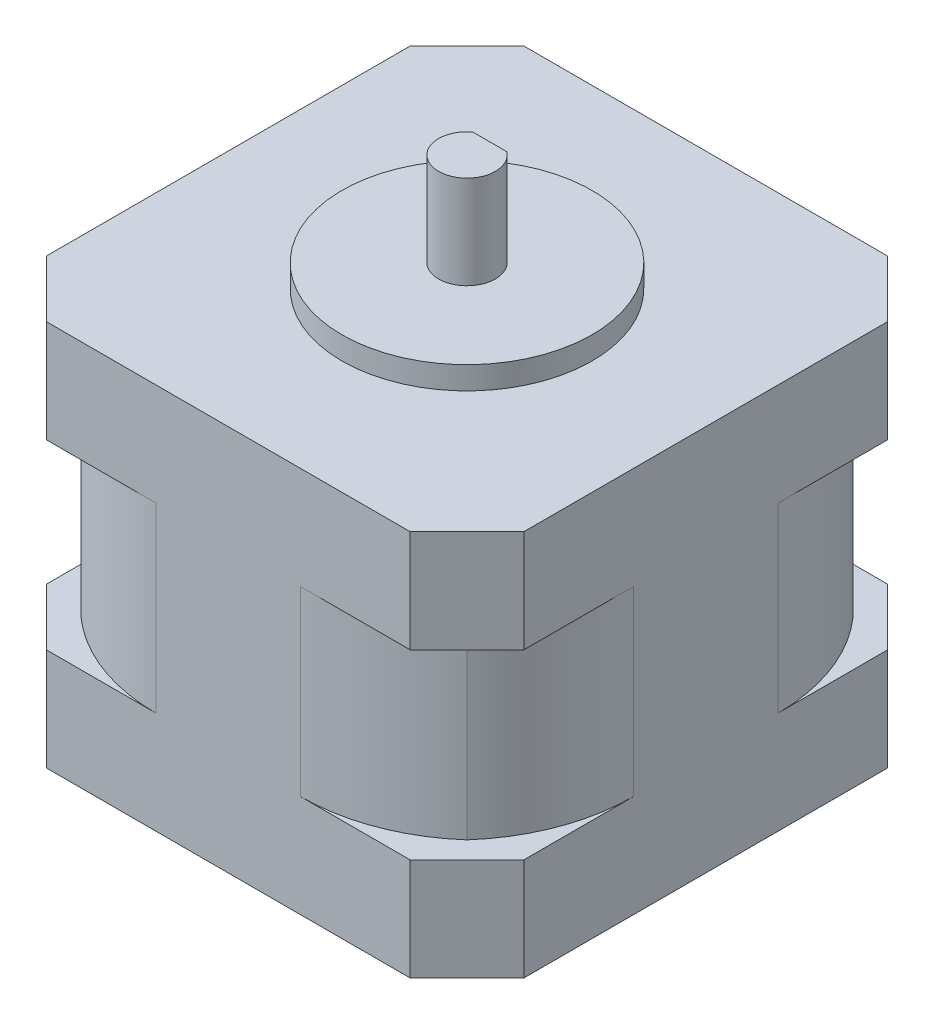
ISO-10303-21;
HEADER;
FILE_DESCRIPTION(('STEP AP214'),'2;1');
FILE_NAME('part.step','',(''),(''),'','','');
FILE_SCHEMA(('AUTOMOTIVE_DESIGN { 1 0 10303 214 1 1 1 1 }'));
ENDSEC;
DATA;
#1=APPLICATION_CONTEXT('core data for automotive mechanical design processes');
#2=APPLICATION_PROTOCOL_DEFINITION('international standard','automotive_design',2000,#1);
#3=PRODUCT_CONTEXT('',#1,'mechanical');
#4=PRODUCT('Part','Part','',(#3));
#5=PRODUCT_RELATED_PRODUCT_CATEGORY('part','',(#4));
#6=PRODUCT_DEFINITION_FORMATION('','',#4);
#7=PRODUCT_DEFINITION_CONTEXT('part definition',#1,'design');
#8=PRODUCT_DEFINITION('design','',#6,#7);
#9=PRODUCT_DEFINITION_SHAPE('','',#8);
#10=(LENGTH_UNIT() NAMED_UNIT(*) SI_UNIT(.MILLI.,.METRE.));
#11=(NAMED_UNIT(*) PLANE_ANGLE_UNIT() SI_UNIT($,.RADIAN.));
#12=(NAMED_UNIT(*) SI_UNIT($,.STERADIAN.) SOLID_ANGLE_UNIT());
#13=UNCERTAINTY_MEASURE_WITH_UNIT(LENGTH_MEASURE(1.E-05),#10,'distance_accuracy_value','');
#14=(GEOMETRIC_REPRESENTATION_CONTEXT(3) GLOBAL_UNCERTAINTY_ASSIGNED_CONTEXT((#13)) GLOBAL_UNIT_ASSIGNED_CONTEXT((#10,
#11,#12)) REPRESENTATION_CONTEXT('',''));
#15=CARTESIAN_POINT('',(0.,0.,0.));
#16=DIRECTION('',(0.,0.,1.));
#17=DIRECTION('',(1.,0.,0.));
#18=AXIS2_PLACEMENT_3D('',#15,#16,#17);
#19=CARTESIAN_POINT('',(21.,17.,21.));
#20=DIRECTION('',(-1.,0.,0.));
#21=DIRECTION('',(0.,0.,1.));
#22=AXIS2_PLACEMENT_3D('',#19,#20,#21);
#23=PLANE('',#22);
#24=DIRECTION('',(0.,0.,-1.));
#25=VECTOR('',#24,1.);
#26=CARTESIAN_POINT('',(21.,-17.,21.));
#27=LINE('',#26,#25);
#28=CARTESIAN_POINT('',(21.,-17.,16.));
#29=VERTEX_POINT('',#28);
#30=CARTESIAN_POINT('',(21.,-17.,-16.));
#31=VERTEX_POINT('',#30);
#32=EDGE_CURVE('E300',#29,#31,#27,.T.);
#33=ORIENTED_EDGE('',*,*,#32,.T.);
#34=DIRECTION('',(0.,1.,0.));
#35=VECTOR('',#34,1.);
#36=CARTESIAN_POINT('',(21.,17.,-16.));
#37=LINE('',#36,#35);
#38=CARTESIAN_POINT('',(20.9999999999998,-8.,-16.));
#39=VERTEX_POINT('',#38);
#40=EDGE_CURVE('E426',#31,#39,#37,.T.);
#41=ORIENTED_EDGE('',*,*,#40,.T.);
#42=DIRECTION('',(0.,0.,-1.));
#43=VECTOR('',#42,1.);
#44=CARTESIAN_POINT('',(20.9999999999999,-8.,-13.0000000000002));
#45=LINE('',#44,#43);
#46=CARTESIAN_POINT('',(20.9999999999999,-8.,-6.37258300203047));
#47=VERTEX_POINT('',#46);
#48=EDGE_CURVE('E281',#47,#39,#45,.T.);
#49=ORIENTED_EDGE('',*,*,#48,.F.);
#50=DIRECTION('',(0.,1.,0.));
#51=VECTOR('',#50,1.);
#52=CARTESIAN_POINT('',(21.,17.,-6.37258300203047));
#53=LINE('',#52,#51);
#54=CARTESIAN_POINT('',(21.,8.,-6.37258300203047));
#55=VERTEX_POINT('',#54);
#56=EDGE_CURVE('E329',#47,#55,#53,.T.);
#57=ORIENTED_EDGE('',*,*,#56,.T.);
#58=DIRECTION('',(0.,0.,-1.));
#59=VECTOR('',#58,1.);
#60=CARTESIAN_POINT('',(20.9999999999999,8.,-13.0000000000002));
#61=LINE('',#60,#59);
#62=CARTESIAN_POINT('',(20.9999999999998,8.,-16.));
#63=VERTEX_POINT('',#62);
#64=EDGE_CURVE('E286',#55,#63,#61,.T.);
#65=ORIENTED_EDGE('',*,*,#64,.T.);
#66=DIRECTION('',(0.,1.,0.));
#67=VECTOR('',#66,1.);
#68=CARTESIAN_POINT('',(21.,17.,-16.));
#69=LINE('',#68,#67);
#70=CARTESIAN_POINT('',(21.,17.,-16.));
#71=VERTEX_POINT('',#70);
#72=EDGE_CURVE('E418',#63,#71,#69,.T.);
#73=ORIENTED_EDGE('',*,*,#72,.T.);
#74=DIRECTION('',(0.,0.,-1.));
#75=VECTOR('',#74,1.);
#76=CARTESIAN_POINT('',(21.,17.,21.));
#77=LINE('',#76,#75);
#78=CARTESIAN_POINT('',(21.,17.,16.));
#79=VERTEX_POINT('',#78);
#80=EDGE_CURVE('E304',#79,#71,#77,.T.);
#81=ORIENTED_EDGE('',*,*,#80,.F.);
#82=DIRECTION('',(0.,-1.,0.));
#83=VECTOR('',#82,1.);
#84=CARTESIAN_POINT('',(21.,17.,16.));
#85=LINE('',#84,#83);
#86=CARTESIAN_POINT('',(21.,8.,16.));
#87=VERTEX_POINT('',#86);
#88=EDGE_CURVE('E420',#79,#87,#85,.T.);
#89=ORIENTED_EDGE('',*,*,#88,.T.);
#90=DIRECTION('',(0.,0.,-1.));
#91=VECTOR('',#90,1.);
#92=CARTESIAN_POINT('',(21.,8.,21.));
#93=LINE('',#92,#91);
#94=CARTESIAN_POINT('',(21.,8.,6.37258300203049));
#95=VERTEX_POINT('',#94);
#96=EDGE_CURVE('E279',#87,#95,#93,.T.);
#97=ORIENTED_EDGE('',*,*,#96,.T.);
#98=DIRECTION('',(0.,1.,0.));
#99=VECTOR('',#98,1.);
#100=CARTESIAN_POINT('',(21.,17.,6.37258300203049));
#101=LINE('',#100,#99);
#102=CARTESIAN_POINT('',(21.,-8.,6.37258300203049));
#103=VERTEX_POINT('',#102);
#104=EDGE_CURVE('E316',#95,#103,#101,.F.);
#105=ORIENTED_EDGE('',*,*,#104,.T.);
#106=DIRECTION('',(0.,0.,-1.));
#107=VECTOR('',#106,1.);
#108=CARTESIAN_POINT('',(21.,-8.,21.));
#109=LINE('',#108,#107);
#110=CARTESIAN_POINT('',(21.,-8.,16.));
#111=VERTEX_POINT('',#110);
#112=EDGE_CURVE('E274',#111,#103,#109,.T.);
#113=ORIENTED_EDGE('',*,*,#112,.F.);
#114=DIRECTION('',(0.,-1.,0.));
#115=VECTOR('',#114,1.);
#116=CARTESIAN_POINT('',(21.,17.,16.));
#117=LINE('',#116,#115);
#118=EDGE_CURVE('E423',#111,#29,#117,.T.);
#119=ORIENTED_EDGE('',*,*,#118,.T.);
#120=EDGE_LOOP('',(#33,#41,#49,#57,#65,#73,#81,#89,#97,#105,#113,#119));
#121=FACE_BOUND('',#120,.T.);
#122=ADVANCED_FACE('F38',(#121),#23,.F.);
#123=CARTESIAN_POINT('',(-21.,17.,-21.));
#124=DIRECTION('',(0.,0.,1.));
#125=DIRECTION('',(1.,0.,0.));
#126=AXIS2_PLACEMENT_3D('',#123,#124,#125);
#127=PLANE('',#126);
#128=DIRECTION('',(-1.,0.,0.));
#129=VECTOR('',#128,1.);
#130=CARTESIAN_POINT('',(20.9999999999998,-8.,-21.0000000000002));
#131=LINE('',#130,#129);
#132=CARTESIAN_POINT('',(16.,-8.,-21.0000000000002));
#133=VERTEX_POINT('',#132);
#134=CARTESIAN_POINT('',(6.3725830020305,-8.,-21.0000000000001));
#135=VERTEX_POINT('',#134);
#136=EDGE_CURVE('E284',#133,#135,#131,.T.);
#137=ORIENTED_EDGE('',*,*,#136,.F.);
#138=DIRECTION('',(0.,-1.,0.));
#139=VECTOR('',#138,1.);
#140=CARTESIAN_POINT('',(16.,17.,-21.));
#141=LINE('',#140,#139);
#142=CARTESIAN_POINT('',(16.,-17.,-21.));
#143=VERTEX_POINT('',#142);
#144=EDGE_CURVE('E407',#133,#143,#141,.T.);
#145=ORIENTED_EDGE('',*,*,#144,.T.);
#146=DIRECTION('',(-1.,0.,0.));
#147=VECTOR('',#146,1.);
#148=CARTESIAN_POINT('',(-21.,-17.,-21.));
#149=LINE('',#148,#147);
#150=CARTESIAN_POINT('',(-16.,-17.,-21.));
#151=VERTEX_POINT('',#150);
#152=EDGE_CURVE('E319',#143,#151,#149,.T.);
#153=ORIENTED_EDGE('',*,*,#152,.T.);
#154=DIRECTION('',(0.,1.,0.));
#155=VECTOR('',#154,1.);
#156=CARTESIAN_POINT('',(-16.,17.,-21.));
#157=LINE('',#156,#155);
#158=CARTESIAN_POINT('',(-16.,-8.,-21.));
#159=VERTEX_POINT('',#158);
#160=EDGE_CURVE('E405',#151,#159,#157,.T.);
#161=ORIENTED_EDGE('',*,*,#160,.T.);
#162=DIRECTION('',(-1.,0.,0.));
#163=VECTOR('',#162,1.);
#164=CARTESIAN_POINT('',(-13.,-8.,-21.));
#165=LINE('',#164,#163);
#166=CARTESIAN_POINT('',(-6.37258300203049,-8.,-21.));
#167=VERTEX_POINT('',#166);
#168=EDGE_CURVE('E296',#167,#159,#165,.T.);
#169=ORIENTED_EDGE('',*,*,#168,.F.);
#170=DIRECTION('',(0.,1.,0.));
#171=VECTOR('',#170,1.);
#172=CARTESIAN_POINT('',(-6.37258300203049,17.,-21.));
#173=LINE('',#172,#171);
#174=CARTESIAN_POINT('',(-6.37258300203049,8.,-21.));
#175=VERTEX_POINT('',#174);
#176=EDGE_CURVE('E332',#167,#175,#173,.T.);
#177=ORIENTED_EDGE('',*,*,#176,.T.);
#178=DIRECTION('',(-1.,0.,0.));
#179=VECTOR('',#178,1.);
#180=CARTESIAN_POINT('',(-13.,8.,-21.));
#181=LINE('',#180,#179);
#182=CARTESIAN_POINT('',(-16.,8.,-21.));
#183=VERTEX_POINT('',#182);
#184=EDGE_CURVE('E297',#175,#183,#181,.T.);
#185=ORIENTED_EDGE('',*,*,#184,.T.);
#186=DIRECTION('',(0.,1.,0.));
#187=VECTOR('',#186,1.);
#188=CARTESIAN_POINT('',(-16.,17.,-21.));
#189=LINE('',#188,#187);
#190=CARTESIAN_POINT('',(-16.,17.,-21.));
#191=VERTEX_POINT('',#190);
#192=EDGE_CURVE('E390',#183,#191,#189,.T.);
#193=ORIENTED_EDGE('',*,*,#192,.T.);
#194=DIRECTION('',(-1.,0.,0.));
#195=VECTOR('',#194,1.);
#196=CARTESIAN_POINT('',(-21.,17.,-21.));
#197=LINE('',#196,#195);
#198=CARTESIAN_POINT('',(16.,17.,-21.));
#199=VERTEX_POINT('',#198);
#200=EDGE_CURVE('E307',#199,#191,#197,.T.);
#201=ORIENTED_EDGE('',*,*,#200,.F.);
#202=DIRECTION('',(0.,-1.,0.));
#203=VECTOR('',#202,1.);
#204=CARTESIAN_POINT('',(16.,17.,-21.));
#205=LINE('',#204,#203);
#206=CARTESIAN_POINT('',(16.,8.,-21.0000000000002));
#207=VERTEX_POINT('',#206);
#208=EDGE_CURVE('E402',#199,#207,#205,.T.);
#209=ORIENTED_EDGE('',*,*,#208,.T.);
#210=DIRECTION('',(-1.,0.,0.));
#211=VECTOR('',#210,1.);
#212=CARTESIAN_POINT('',(20.9999999999998,8.,-21.0000000000002));
#213=LINE('',#212,#211);
#214=CARTESIAN_POINT('',(6.3725830020305,8.,-21.));
#215=VERTEX_POINT('',#214);
#216=EDGE_CURVE('E289',#207,#215,#213,.T.);
#217=ORIENTED_EDGE('',*,*,#216,.T.);
#218=DIRECTION('',(0.,1.,0.));
#219=VECTOR('',#218,1.);
#220=CARTESIAN_POINT('',(6.37258300203049,17.,-21.));
#221=LINE('',#220,#219);
#222=EDGE_CURVE('E335',#215,#135,#221,.F.);
#223=ORIENTED_EDGE('',*,*,#222,.T.);
#224=EDGE_LOOP('',(#137,#145,#153,#161,#169,#177,#185,#193,#201,#209,#217,#223));
#225=FACE_BOUND('',#224,.T.);
#226=ADVANCED_FACE('F478',(#225),#127,.F.);
#227=CARTESIAN_POINT('',(-21.,17.,21.));
#228=DIRECTION('',(1.,0.,0.));
#229=DIRECTION('',(0.,0.,-1.));
#230=AXIS2_PLACEMENT_3D('',#227,#228,#229);
#231=PLANE('',#230);
#232=DIRECTION('',(0.,0.,1.));
#233=VECTOR('',#232,1.);
#234=CARTESIAN_POINT('',(-21.,-8.,-21.));
#235=LINE('',#234,#233);
#236=CARTESIAN_POINT('',(-21.,-8.,-16.));
#237=VERTEX_POINT('',#236);
#238=CARTESIAN_POINT('',(-21.,-8.,-6.37258300203048));
#239=VERTEX_POINT('',#238);
#240=EDGE_CURVE('E294',#237,#239,#235,.T.);
#241=ORIENTED_EDGE('',*,*,#240,.F.);
#242=DIRECTION('',(0.,-1.,0.));
#243=VECTOR('',#242,1.);
#244=CARTESIAN_POINT('',(-21.,17.,-16.));
#245=LINE('',#244,#243);
#246=CARTESIAN_POINT('',(-21.,-17.,-16.));
#247=VERTEX_POINT('',#246);
#248=EDGE_CURVE('E448',#237,#247,#245,.T.);
#249=ORIENTED_EDGE('',*,*,#248,.T.);
#250=DIRECTION('',(0.,0.,1.));
#251=VECTOR('',#250,1.);
#252=CARTESIAN_POINT('',(-21.,-17.,21.));
#253=LINE('',#252,#251);
#254=CARTESIAN_POINT('',(-21.,-17.,16.));
#255=VERTEX_POINT('',#254);
#256=EDGE_CURVE('E322',#247,#255,#253,.T.);
#257=ORIENTED_EDGE('',*,*,#256,.T.);
#258=DIRECTION('',(0.,1.,0.));
#259=VECTOR('',#258,1.);
#260=CARTESIAN_POINT('',(-21.,17.,16.));
#261=LINE('',#260,#259);
#262=CARTESIAN_POINT('',(-20.9999999999999,-8.,16.));
#263=VERTEX_POINT('',#262);
#264=EDGE_CURVE('E446',#255,#263,#261,.T.);
#265=ORIENTED_EDGE('',*,*,#264,.T.);
#266=DIRECTION('',(0.,0.,1.));
#267=VECTOR('',#266,1.);
#268=CARTESIAN_POINT('',(-21.,-8.,13.0000000000001));
#269=LINE('',#268,#267);
#270=CARTESIAN_POINT('',(-21.,-8.,6.37258300203047));
#271=VERTEX_POINT('',#270);
#272=EDGE_CURVE('E265',#271,#263,#269,.T.);
#273=ORIENTED_EDGE('',*,*,#272,.F.);
#274=DIRECTION('',(0.,1.,0.));
#275=VECTOR('',#274,1.);
#276=CARTESIAN_POINT('',(-21.,17.,6.37258300203047));
#277=LINE('',#276,#275);
#278=CARTESIAN_POINT('',(-21.,8.,6.37258300203047));
#279=VERTEX_POINT('',#278);
#280=EDGE_CURVE('E338',#271,#279,#277,.T.);
#281=ORIENTED_EDGE('',*,*,#280,.T.);
#282=DIRECTION('',(0.,0.,1.));
#283=VECTOR('',#282,1.);
#284=CARTESIAN_POINT('',(-21.,8.,13.0000000000001));
#285=LINE('',#284,#283);
#286=CARTESIAN_POINT('',(-20.9999999999999,8.,16.));
#287=VERTEX_POINT('',#286);
#288=EDGE_CURVE('E266',#279,#287,#285,.T.);
#289=ORIENTED_EDGE('',*,*,#288,.T.);
#290=DIRECTION('',(0.,1.,0.));
#291=VECTOR('',#290,1.);
#292=CARTESIAN_POINT('',(-21.,17.,16.));
#293=LINE('',#292,#291);
#294=CARTESIAN_POINT('',(-21.,17.,16.));
#295=VERTEX_POINT('',#294);
#296=EDGE_CURVE('E63',#287,#295,#293,.T.);
#297=ORIENTED_EDGE('',*,*,#296,.T.);
#298=DIRECTION('',(0.,0.,1.));
#299=VECTOR('',#298,1.);
#300=CARTESIAN_POINT('',(-21.,17.,21.));
#301=LINE('',#300,#299);
#302=CARTESIAN_POINT('',(-21.,17.,-16.));
#303=VERTEX_POINT('',#302);
#304=EDGE_CURVE('E311',#303,#295,#301,.T.);
#305=ORIENTED_EDGE('',*,*,#304,.F.);
#306=DIRECTION('',(0.,-1.,0.));
#307=VECTOR('',#306,1.);
#308=CARTESIAN_POINT('',(-21.,17.,-16.));
#309=LINE('',#308,#307);
#310=CARTESIAN_POINT('',(-21.,8.,-16.));
#311=VERTEX_POINT('',#310);
#312=EDGE_CURVE('E442',#303,#311,#309,.T.);
#313=ORIENTED_EDGE('',*,*,#312,.T.);
#314=DIRECTION('',(0.,0.,1.));
#315=VECTOR('',#314,1.);
#316=CARTESIAN_POINT('',(-21.,8.,-21.));
#317=LINE('',#316,#315);
#318=CARTESIAN_POINT('',(-21.,8.,-6.37258300203048));
#319=VERTEX_POINT('',#318);
#320=EDGE_CURVE('E269',#311,#319,#317,.T.);
#321=ORIENTED_EDGE('',*,*,#320,.T.);
#322=DIRECTION('',(0.,1.,0.));
#323=VECTOR('',#322,1.);
#324=CARTESIAN_POINT('',(-21.,17.,-6.37258300203048));
#325=LINE('',#324,#323);
#326=EDGE_CURVE('E341',#319,#239,#325,.F.);
#327=ORIENTED_EDGE('',*,*,#326,.T.);
#328=EDGE_LOOP('',(#241,#249,#257,#265,#273,#281,#289,#297,#305,#313,#321,#327));
#329=FACE_BOUND('',#328,.T.);
#330=ADVANCED_FACE('F486',(#329),#231,.F.);
#331=CARTESIAN_POINT('',(-21.,17.,21.));
#332=DIRECTION('',(0.,0.,-1.));
#333=DIRECTION('',(-1.,0.,0.));
#334=AXIS2_PLACEMENT_3D('',#331,#332,#333);
#335=PLANE('',#334);
#336=DIRECTION('',(1.,0.,0.));
#337=VECTOR('',#336,1.);
#338=CARTESIAN_POINT('',(-21.,-17.,21.));
#339=LINE('',#338,#337);
#340=CARTESIAN_POINT('',(-16.,-17.,21.));
#341=VERTEX_POINT('',#340);
#342=CARTESIAN_POINT('',(16.,-17.,21.));
#343=VERTEX_POINT('',#342);
#344=EDGE_CURVE('E308',#341,#343,#339,.T.);
#345=ORIENTED_EDGE('',*,*,#344,.T.);
#346=DIRECTION('',(0.,1.,0.));
#347=VECTOR('',#346,1.);
#348=CARTESIAN_POINT('',(16.,17.,21.));
#349=LINE('',#348,#347);
#350=CARTESIAN_POINT('',(16.,-8.,21.));
#351=VERTEX_POINT('',#350);
#352=EDGE_CURVE('E438',#343,#351,#349,.T.);
#353=ORIENTED_EDGE('',*,*,#352,.T.);
#354=DIRECTION('',(1.,0.,0.));
#355=VECTOR('',#354,1.);
#356=CARTESIAN_POINT('',(13.,-8.,21.));
#357=LINE('',#356,#355);
#358=CARTESIAN_POINT('',(6.37258300203048,-8.,21.));
#359=VERTEX_POINT('',#358);
#360=EDGE_CURVE('E272',#359,#351,#357,.T.);
#361=ORIENTED_EDGE('',*,*,#360,.F.);
#362=DIRECTION('',(0.,1.,0.));
#363=VECTOR('',#362,1.);
#364=CARTESIAN_POINT('',(6.37258300203048,17.,21.));
#365=LINE('',#364,#363);
#366=CARTESIAN_POINT('',(6.37258300203048,8.,21.));
#367=VERTEX_POINT('',#366);
#368=EDGE_CURVE('E344',#359,#367,#365,.T.);
#369=ORIENTED_EDGE('',*,*,#368,.T.);
#370=DIRECTION('',(1.,0.,0.));
#371=VECTOR('',#370,1.);
#372=CARTESIAN_POINT('',(13.,8.,21.));
#373=LINE('',#372,#371);
#374=CARTESIAN_POINT('',(16.,8.,21.));
#375=VERTEX_POINT('',#374);
#376=EDGE_CURVE('E276',#367,#375,#373,.T.);
#377=ORIENTED_EDGE('',*,*,#376,.T.);
#378=DIRECTION('',(0.,1.,0.));
#379=VECTOR('',#378,1.);
#380=CARTESIAN_POINT('',(16.,17.,21.));
#381=LINE('',#380,#379);
#382=CARTESIAN_POINT('',(16.,17.,21.));
#383=VERTEX_POINT('',#382);
#384=EDGE_CURVE('E430',#375,#383,#381,.T.);
#385=ORIENTED_EDGE('',*,*,#384,.T.);
#386=DIRECTION('',(1.,0.,0.));
#387=VECTOR('',#386,1.);
#388=CARTESIAN_POINT('',(-21.,17.,21.));
#389=LINE('',#388,#387);
#390=CARTESIAN_POINT('',(-16.,17.,21.));
#391=VERTEX_POINT('',#390);
#392=EDGE_CURVE('E313',#391,#383,#389,.T.);
#393=ORIENTED_EDGE('',*,*,#392,.F.);
#394=DIRECTION('',(0.,-1.,0.));
#395=VECTOR('',#394,1.);
#396=CARTESIAN_POINT('',(-16.,17.,21.));
#397=LINE('',#396,#395);
#398=CARTESIAN_POINT('',(-16.,8.,21.0000000000001));
#399=VERTEX_POINT('',#398);
#400=EDGE_CURVE('E432',#391,#399,#397,.T.);
#401=ORIENTED_EDGE('',*,*,#400,.T.);
#402=DIRECTION('',(1.,0.,0.));
#403=VECTOR('',#402,1.);
#404=CARTESIAN_POINT('',(-20.9999999999999,8.,21.0000000000001));
#405=LINE('',#404,#403);
#406=CARTESIAN_POINT('',(-6.37258300203049,8.,21.));
#407=VERTEX_POINT('',#406);
#408=EDGE_CURVE('E270',#399,#407,#405,.T.);
#409=ORIENTED_EDGE('',*,*,#408,.T.);
#410=DIRECTION('',(0.,1.,0.));
#411=VECTOR('',#410,1.);
#412=CARTESIAN_POINT('',(-6.37258300203049,17.,21.));
#413=LINE('',#412,#411);
#414=CARTESIAN_POINT('',(-6.37258300203049,-8.,21.));
#415=VERTEX_POINT('',#414);
#416=EDGE_CURVE('E347',#407,#415,#413,.F.);
#417=ORIENTED_EDGE('',*,*,#416,.T.);
#418=DIRECTION('',(1.,0.,0.));
#419=VECTOR('',#418,1.);
#420=CARTESIAN_POINT('',(-20.9999999999999,-8.,21.0000000000001));
#421=LINE('',#420,#419);
#422=CARTESIAN_POINT('',(-16.,-8.,21.0000000000001));
#423=VERTEX_POINT('',#422);
#424=EDGE_CURVE('E263',#423,#415,#421,.T.);
#425=ORIENTED_EDGE('',*,*,#424,.F.);
#426=DIRECTION('',(0.,-1.,0.));
#427=VECTOR('',#426,1.);
#428=CARTESIAN_POINT('',(-16.,17.,21.));
#429=LINE('',#428,#427);
#430=EDGE_CURVE('E435',#423,#341,#429,.T.);
#431=ORIENTED_EDGE('',*,*,#430,.T.);
#432=EDGE_LOOP('',(#345,#353,#361,#369,#377,#385,#393,#401,#409,#417,#425,#431));
#433=FACE_BOUND('',#432,.T.);
#434=ADVANCED_FACE('F520',(#433),#335,.F.);
#435=CARTESIAN_POINT('',(0.,17.,0.));
#436=DIRECTION('',(0.,-1.,0.));
#437=DIRECTION('',(0.,0.,-1.));
#438=AXIS2_PLACEMENT_3D('',#435,#436,#437);
#439=PLANE('',#438);
#440=CARTESIAN_POINT('',(0.,17.,0.));
#441=DIRECTION('',(0.,1.,0.));
#442=DIRECTION('',(0.,0.,1.));
#443=AXIS2_PLACEMENT_3D('',#440,#441,#442);
#444=CIRCLE('',#443,11.);
#445=CARTESIAN_POINT('',(0.,17.,11.));
#446=VERTEX_POINT('',#445);
#447=EDGE_CURVE('E11',#446,#446,#444,.T.);
#448=ORIENTED_EDGE('',*,*,#447,.F.);
#449=EDGE_LOOP('',(#448));
#450=FACE_BOUND('',#449,.T.);
#451=ORIENTED_EDGE('',*,*,#304,.T.);
#452=DIRECTION('',(-0.707106781186546,0.,-0.707106781186549));
#453=VECTOR('',#452,1.);
#454=CARTESIAN_POINT('',(-16.,17.,21.));
#455=LINE('',#454,#453);
#456=EDGE_CURVE('E463',#295,#391,#455,.F.);
#457=ORIENTED_EDGE('',*,*,#456,.T.);
#458=ORIENTED_EDGE('',*,*,#392,.T.);
#459=DIRECTION('',(-0.707106781186549,0.,0.707106781186546));
#460=VECTOR('',#459,1.);
#461=CARTESIAN_POINT('',(21.,17.,16.));
#462=LINE('',#461,#460);
#463=EDGE_CURVE('E461',#383,#79,#462,.F.);
#464=ORIENTED_EDGE('',*,*,#463,.T.);
#465=ORIENTED_EDGE('',*,*,#80,.T.);
#466=DIRECTION('',(0.707106781186546,0.,0.707106781186549));
#467=VECTOR('',#466,1.);
#468=CARTESIAN_POINT('',(16.,17.,-21.));
#469=LINE('',#468,#467);
#470=EDGE_CURVE('E459',#71,#199,#469,.F.);
#471=ORIENTED_EDGE('',*,*,#470,.T.);
#472=ORIENTED_EDGE('',*,*,#200,.T.);
#473=DIRECTION('',(0.707106781186549,0.,-0.707106781186546));
#474=VECTOR('',#473,1.);
#475=CARTESIAN_POINT('',(-21.,17.,-16.));
#476=LINE('',#475,#474);
#477=EDGE_CURVE('E457',#191,#303,#476,.F.);
#478=ORIENTED_EDGE('',*,*,#477,.T.);
#479=EDGE_LOOP('',(#451,#457,#458,#464,#465,#471,#472,#478));
#480=FACE_BOUND('',#479,.T.);
#481=ADVANCED_FACE('F483',(#450,#480),#439,.F.);
#482=CARTESIAN_POINT('',(0.,-17.,0.));
#483=DIRECTION('',(0.,-1.,0.));
#484=DIRECTION('',(0.,0.,-1.));
#485=AXIS2_PLACEMENT_3D('',#482,#483,#484);
#486=PLANE('',#485);
#487=ORIENTED_EDGE('',*,*,#152,.F.);
#488=DIRECTION('',(-0.707106781186546,0.,-0.707106781186549));
#489=VECTOR('',#488,1.);
#490=CARTESIAN_POINT('',(18.5,-17.,-18.5));
#491=LINE('',#490,#489);
#492=EDGE_CURVE('E416',#143,#31,#491,.F.);
#493=ORIENTED_EDGE('',*,*,#492,.T.);
#494=ORIENTED_EDGE('',*,*,#32,.F.);
#495=DIRECTION('',(0.707106781186549,0.,-0.707106781186546));
#496=VECTOR('',#495,1.);
#497=CARTESIAN_POINT('',(18.5,-17.,18.5));
#498=LINE('',#497,#496);
#499=EDGE_CURVE('E414',#29,#343,#498,.F.);
#500=ORIENTED_EDGE('',*,*,#499,.T.);
#501=ORIENTED_EDGE('',*,*,#344,.F.);
#502=DIRECTION('',(0.707106781186546,0.,0.707106781186549));
#503=VECTOR('',#502,1.);
#504=CARTESIAN_POINT('',(-18.5,-17.,18.5));
#505=LINE('',#504,#503);
#506=EDGE_CURVE('E410',#341,#255,#505,.F.);
#507=ORIENTED_EDGE('',*,*,#506,.T.);
#508=ORIENTED_EDGE('',*,*,#256,.F.);
#509=DIRECTION('',(-0.707106781186549,0.,0.707106781186546));
#510=VECTOR('',#509,1.);
#511=CARTESIAN_POINT('',(-18.5,-17.,-18.5));
#512=LINE('',#511,#510);
#513=EDGE_CURVE('E412',#247,#151,#512,.F.);
#514=ORIENTED_EDGE('',*,*,#513,.T.);
#515=EDGE_LOOP('',(#487,#493,#494,#500,#501,#507,#508,#514));
#516=FACE_BOUND('',#515,.T.);
#517=ADVANCED_FACE('F504',(#516),#486,.T.);
#518=CARTESIAN_POINT('',(0.,-8.,0.));
#519=DIRECTION('',(0.,-1.,0.));
#520=DIRECTION('',(0.,0.,-1.));
#521=AXIS2_PLACEMENT_3D('',#518,#519,#520);
#522=PLANE('',#521);
#523=ORIENTED_EDGE('',*,*,#168,.T.);
#524=DIRECTION('',(0.707106781186549,0.,-0.707106781186546));
#525=VECTOR('',#524,1.);
#526=CARTESIAN_POINT('',(-21.,-8.,-16.));
#527=LINE('',#526,#525);
#528=EDGE_CURVE('E451',#159,#237,#527,.F.);
#529=ORIENTED_EDGE('',*,*,#528,.T.);
#530=ORIENTED_EDGE('',*,*,#240,.T.);
#531=CARTESIAN_POINT('',(-5.,-8.,-6.37258300203048));
#532=DIRECTION('',(0.,-1.,0.));
#533=DIRECTION('',(0.,0.,-1.));
#534=AXIS2_PLACEMENT_3D('',#531,#532,#533);
#535=CIRCLE('',#534,16.);
#536=CARTESIAN_POINT('',(-16.979165536248,-8.,-16.979165536248));
#537=VERTEX_POINT('',#536);
#538=EDGE_CURVE('E368',#239,#537,#535,.T.);
#539=ORIENTED_EDGE('',*,*,#538,.T.);
#540=CARTESIAN_POINT('',(-6.37258300203049,-8.,-5.));
#541=DIRECTION('',(0.,-1.,0.));
#542=DIRECTION('',(0.,0.,-1.));
#543=AXIS2_PLACEMENT_3D('',#540,#541,#542);
#544=CIRCLE('',#543,16.);
#545=EDGE_CURVE('E362',#537,#167,#544,.T.);
#546=ORIENTED_EDGE('',*,*,#545,.T.);
#547=EDGE_LOOP('',(#523,#529,#530,#539,#546));
#548=FACE_BOUND('',#547,.T.);
#549=ADVANCED_FACE('F495',(#548),#522,.F.);
#550=CARTESIAN_POINT('',(0.,8.,0.));
#551=DIRECTION('',(0.,-1.,0.));
#552=DIRECTION('',(0.,0.,-1.));
#553=AXIS2_PLACEMENT_3D('',#550,#551,#552);
#554=PLANE('',#553);
#555=ORIENTED_EDGE('',*,*,#320,.F.);
#556=DIRECTION('',(-0.707106781186549,0.,0.707106781186546));
#557=VECTOR('',#556,1.);
#558=CARTESIAN_POINT('',(-18.5,8.,-18.5));
#559=LINE('',#558,#557);
#560=EDGE_CURVE('E43',#311,#183,#559,.F.);
#561=ORIENTED_EDGE('',*,*,#560,.T.);
#562=ORIENTED_EDGE('',*,*,#184,.F.);
#563=CARTESIAN_POINT('',(-6.37258300203049,8.,-5.));
#564=DIRECTION('',(0.,-1.,0.));
#565=DIRECTION('',(0.,0.,-1.));
#566=AXIS2_PLACEMENT_3D('',#563,#564,#565);
#567=CIRCLE('',#566,16.);
#568=CARTESIAN_POINT('',(-16.979165536248,8.,-16.979165536248));
#569=VERTEX_POINT('',#568);
#570=EDGE_CURVE('E360',#175,#569,#567,.F.);
#571=ORIENTED_EDGE('',*,*,#570,.T.);
#572=CARTESIAN_POINT('',(-5.,8.,-6.37258300203048));
#573=DIRECTION('',(0.,-1.,0.));
#574=DIRECTION('',(0.,0.,-1.));
#575=AXIS2_PLACEMENT_3D('',#572,#573,#574);
#576=CIRCLE('',#575,16.);
#577=EDGE_CURVE('E365',#569,#319,#576,.F.);
#578=ORIENTED_EDGE('',*,*,#577,.T.);
#579=EDGE_LOOP('',(#555,#561,#562,#571,#578));
#580=FACE_BOUND('',#579,.T.);
#581=ADVANCED_FACE('F471',(#580),#554,.T.);
#582=CARTESIAN_POINT('',(0.,-8.,0.));
#583=DIRECTION('',(0.,-1.,0.));
#584=DIRECTION('',(0.,0.,1.));
#585=AXIS2_PLACEMENT_3D('',#582,#583,#584);
#586=PLANE('',#585);
#587=ORIENTED_EDGE('',*,*,#360,.T.);
#588=DIRECTION('',(-0.707106781186549,0.,0.707106781186546));
#589=VECTOR('',#588,1.);
#590=CARTESIAN_POINT('',(21.,-8.,16.));
#591=LINE('',#590,#589);
#592=EDGE_CURVE('E440',#351,#111,#591,.F.);
#593=ORIENTED_EDGE('',*,*,#592,.T.);
#594=ORIENTED_EDGE('',*,*,#112,.T.);
#595=CARTESIAN_POINT('',(5.,-8.,6.37258300203049));
#596=DIRECTION('',(0.,-1.,0.));
#597=DIRECTION('',(0.,0.,-1.));
#598=AXIS2_PLACEMENT_3D('',#595,#596,#597);
#599=CIRCLE('',#598,16.);
#600=CARTESIAN_POINT('',(16.979165536248,-8.,16.979165536248));
#601=VERTEX_POINT('',#600);
#602=EDGE_CURVE('E388',#103,#601,#599,.T.);
#603=ORIENTED_EDGE('',*,*,#602,.T.);
#604=CARTESIAN_POINT('',(6.37258300203048,-8.,5.));
#605=DIRECTION('',(0.,-1.,0.));
#606=DIRECTION('',(0.,0.,-1.));
#607=AXIS2_PLACEMENT_3D('',#604,#605,#606);
#608=CIRCLE('',#607,16.);
#609=EDGE_CURVE('E382',#601,#359,#608,.T.);
#610=ORIENTED_EDGE('',*,*,#609,.T.);
#611=EDGE_LOOP('',(#587,#593,#594,#603,#610));
#612=FACE_BOUND('',#611,.T.);
#613=ADVANCED_FACE('F595',(#612),#586,.F.);
#614=CARTESIAN_POINT('',(0.,8.,0.));
#615=DIRECTION('',(0.,-1.,0.));
#616=DIRECTION('',(0.,0.,1.));
#617=AXIS2_PLACEMENT_3D('',#614,#615,#616);
#618=PLANE('',#617);
#619=ORIENTED_EDGE('',*,*,#96,.F.);
#620=DIRECTION('',(0.707106781186549,0.,-0.707106781186546));
#621=VECTOR('',#620,1.);
#622=CARTESIAN_POINT('',(18.5,8.,18.5));
#623=LINE('',#622,#621);
#624=EDGE_CURVE('E465',#87,#375,#623,.F.);
#625=ORIENTED_EDGE('',*,*,#624,.T.);
#626=ORIENTED_EDGE('',*,*,#376,.F.);
#627=CARTESIAN_POINT('',(6.37258300203048,8.,5.));
#628=DIRECTION('',(0.,-1.,0.));
#629=DIRECTION('',(0.,0.,-1.));
#630=AXIS2_PLACEMENT_3D('',#627,#628,#629);
#631=CIRCLE('',#630,16.);
#632=CARTESIAN_POINT('',(16.979165536248,8.,16.979165536248));
#633=VERTEX_POINT('',#632);
#634=EDGE_CURVE('E380',#367,#633,#631,.F.);
#635=ORIENTED_EDGE('',*,*,#634,.T.);
#636=CARTESIAN_POINT('',(5.,8.,6.37258300203049));
#637=DIRECTION('',(0.,-1.,0.));
#638=DIRECTION('',(0.,0.,-1.));
#639=AXIS2_PLACEMENT_3D('',#636,#637,#638);
#640=CIRCLE('',#639,16.);
#641=EDGE_CURVE('E385',#633,#95,#640,.F.);
#642=ORIENTED_EDGE('',*,*,#641,.T.);
#643=EDGE_LOOP('',(#619,#625,#626,#635,#642));
#644=FACE_BOUND('',#643,.T.);
#645=ADVANCED_FACE('F603',(#644),#618,.T.);
#646=CARTESIAN_POINT('',(0.,-8.,0.));
#647=DIRECTION('',(0.,-1.,0.));
#648=DIRECTION('',(-1.,0.,0.));
#649=AXIS2_PLACEMENT_3D('',#646,#647,#648);
#650=PLANE('',#649);
#651=ORIENTED_EDGE('',*,*,#272,.T.);
#652=DIRECTION('',(-0.707106781186546,0.,-0.707106781186549));
#653=VECTOR('',#652,1.);
#654=CARTESIAN_POINT('',(-16.,-8.,21.));
#655=LINE('',#654,#653);
#656=EDGE_CURVE('E453',#263,#423,#655,.F.);
#657=ORIENTED_EDGE('',*,*,#656,.T.);
#658=ORIENTED_EDGE('',*,*,#424,.T.);
#659=CARTESIAN_POINT('',(-6.37258300203049,-8.,5.));
#660=DIRECTION('',(0.,-1.,0.));
#661=DIRECTION('',(0.,0.,-1.));
#662=AXIS2_PLACEMENT_3D('',#659,#660,#661);
#663=CIRCLE('',#662,16.);
#664=CARTESIAN_POINT('',(-16.979165536248,-8.,16.979165536248));
#665=VERTEX_POINT('',#664);
#666=EDGE_CURVE('E378',#415,#665,#663,.T.);
#667=ORIENTED_EDGE('',*,*,#666,.T.);
#668=CARTESIAN_POINT('',(-5.,-8.,6.37258300203047));
#669=DIRECTION('',(0.,-1.,0.));
#670=DIRECTION('',(0.,0.,-1.));
#671=AXIS2_PLACEMENT_3D('',#668,#669,#670);
#672=CIRCLE('',#671,16.);
#673=EDGE_CURVE('E372',#665,#271,#672,.T.);
#674=ORIENTED_EDGE('',*,*,#673,.T.);
#675=EDGE_LOOP('',(#651,#657,#658,#667,#674));
#676=FACE_BOUND('',#675,.T.);
#677=ADVANCED_FACE('F528',(#676),#650,.F.);
#678=CARTESIAN_POINT('',(0.,8.,0.));
#679=DIRECTION('',(0.,-1.,0.));
#680=DIRECTION('',(-1.,0.,0.));
#681=AXIS2_PLACEMENT_3D('',#678,#679,#680);
#682=PLANE('',#681);
#683=ORIENTED_EDGE('',*,*,#408,.F.);
#684=DIRECTION('',(0.707106781186546,0.,0.707106781186549));
#685=VECTOR('',#684,1.);
#686=CARTESIAN_POINT('',(-18.5,8.,18.5));
#687=LINE('',#686,#685);
#688=EDGE_CURVE('E455',#399,#287,#687,.F.);
#689=ORIENTED_EDGE('',*,*,#688,.T.);
#690=ORIENTED_EDGE('',*,*,#288,.F.);
#691=CARTESIAN_POINT('',(-5.,8.,6.37258300203047));
#692=DIRECTION('',(0.,-1.,0.));
#693=DIRECTION('',(0.,0.,-1.));
#694=AXIS2_PLACEMENT_3D('',#691,#692,#693);
#695=CIRCLE('',#694,16.);
#696=CARTESIAN_POINT('',(-16.979165536248,8.,16.979165536248));
#697=VERTEX_POINT('',#696);
#698=EDGE_CURVE('E370',#279,#697,#695,.F.);
#699=ORIENTED_EDGE('',*,*,#698,.T.);
#700=CARTESIAN_POINT('',(-6.37258300203049,8.,5.));
#701=DIRECTION('',(0.,-1.,0.));
#702=DIRECTION('',(0.,0.,-1.));
#703=AXIS2_PLACEMENT_3D('',#700,#701,#702);
#704=CIRCLE('',#703,16.);
#705=EDGE_CURVE('E375',#697,#407,#704,.F.);
#706=ORIENTED_EDGE('',*,*,#705,.T.);
#707=EDGE_LOOP('',(#683,#689,#690,#699,#706));
#708=FACE_BOUND('',#707,.T.);
#709=ADVANCED_FACE('F602',(#708),#682,.T.);
#710=CARTESIAN_POINT('',(0.,-8.,0.));
#711=DIRECTION('',(0.,-1.,0.));
#712=DIRECTION('',(1.,0.,0.));
#713=AXIS2_PLACEMENT_3D('',#710,#711,#712);
#714=PLANE('',#713);
#715=ORIENTED_EDGE('',*,*,#48,.T.);
#716=DIRECTION('',(0.707106781186546,0.,0.707106781186549));
#717=VECTOR('',#716,1.);
#718=CARTESIAN_POINT('',(16.,-8.,-21.));
#719=LINE('',#718,#717);
#720=EDGE_CURVE('E428',#39,#133,#719,.F.);
#721=ORIENTED_EDGE('',*,*,#720,.T.);
#722=ORIENTED_EDGE('',*,*,#136,.T.);
#723=CARTESIAN_POINT('',(6.3725830020305,-8.,-5.));
#724=DIRECTION('',(0.,-1.,0.));
#725=DIRECTION('',(0.,0.,-1.));
#726=AXIS2_PLACEMENT_3D('',#723,#724,#725);
#727=CIRCLE('',#726,16.);
#728=CARTESIAN_POINT('',(16.9791655362479,-8.,-16.9791655362481));
#729=VERTEX_POINT('',#728);
#730=EDGE_CURVE('E358',#135,#729,#727,.T.);
#731=ORIENTED_EDGE('',*,*,#730,.T.);
#732=CARTESIAN_POINT('',(5.,-8.,-6.37258300203047));
#733=DIRECTION('',(0.,-1.,0.));
#734=DIRECTION('',(0.,0.,-1.));
#735=AXIS2_PLACEMENT_3D('',#732,#733,#734);
#736=CIRCLE('',#735,16.);
#737=EDGE_CURVE('E352',#729,#47,#736,.T.);
#738=ORIENTED_EDGE('',*,*,#737,.T.);
#739=EDGE_LOOP('',(#715,#721,#722,#731,#738));
#740=FACE_BOUND('',#739,.T.);
#741=ADVANCED_FACE('F564',(#740),#714,.F.);
#742=CARTESIAN_POINT('',(0.,8.,0.));
#743=DIRECTION('',(0.,-1.,0.));
#744=DIRECTION('',(1.,0.,0.));
#745=AXIS2_PLACEMENT_3D('',#742,#743,#744);
#746=PLANE('',#745);
#747=ORIENTED_EDGE('',*,*,#216,.F.);
#748=DIRECTION('',(-0.707106781186546,0.,-0.707106781186549));
#749=VECTOR('',#748,1.);
#750=CARTESIAN_POINT('',(18.5,8.,-18.5));
#751=LINE('',#750,#749);
#752=EDGE_CURVE('E466',#207,#63,#751,.F.);
#753=ORIENTED_EDGE('',*,*,#752,.T.);
#754=ORIENTED_EDGE('',*,*,#64,.F.);
#755=CARTESIAN_POINT('',(5.,8.,-6.37258300203047));
#756=DIRECTION('',(0.,-1.,0.));
#757=DIRECTION('',(0.,0.,-1.));
#758=AXIS2_PLACEMENT_3D('',#755,#756,#757);
#759=CIRCLE('',#758,16.);
#760=CARTESIAN_POINT('',(16.9791655362479,8.,-16.9791655362481));
#761=VERTEX_POINT('',#760);
#762=EDGE_CURVE('E350',#55,#761,#759,.F.);
#763=ORIENTED_EDGE('',*,*,#762,.T.);
#764=CARTESIAN_POINT('',(6.3725830020305,8.,-5.));
#765=DIRECTION('',(0.,-1.,0.));
#766=DIRECTION('',(0.,0.,-1.));
#767=AXIS2_PLACEMENT_3D('',#764,#765,#766);
#768=CIRCLE('',#767,16.);
#769=EDGE_CURVE('E355',#761,#215,#768,.F.);
#770=ORIENTED_EDGE('',*,*,#769,.T.);
#771=EDGE_LOOP('',(#747,#753,#754,#763,#770));
#772=FACE_BOUND('',#771,.T.);
#773=ADVANCED_FACE('F554',(#772),#746,.T.);
#774=CARTESIAN_POINT('',(6.3725830020305,-8.,-5.));
#775=DIRECTION('',(0.,1.,0.));
#776=DIRECTION('',(0.,0.,1.));
#777=AXIS2_PLACEMENT_3D('',#774,#775,#776);
#778=CYLINDRICAL_SURFACE('',#777,16.);
#779=DIRECTION('',(0.,1.,0.));
#780=VECTOR('',#779,1.);
#781=CARTESIAN_POINT('',(16.9791655362479,0.,-16.9791655362481));
#782=LINE('',#781,#780);
#783=EDGE_CURVE('E291',#729,#761,#782,.T.);
#784=ORIENTED_EDGE('',*,*,#783,.F.);
#785=ORIENTED_EDGE('',*,*,#730,.F.);
#786=ORIENTED_EDGE('',*,*,#222,.F.);
#787=ORIENTED_EDGE('',*,*,#769,.F.);
#788=EDGE_LOOP('',(#784,#785,#786,#787));
#789=FACE_BOUND('',#788,.T.);
#790=ADVANCED_FACE('F561',(#789),#778,.T.);
#791=CARTESIAN_POINT('',(5.,17.,-6.37258300203047));
#792=DIRECTION('',(0.,1.,0.));
#793=DIRECTION('',(0.,0.,1.));
#794=AXIS2_PLACEMENT_3D('',#791,#792,#793);
#795=CYLINDRICAL_SURFACE('',#794,16.);
#796=ORIENTED_EDGE('',*,*,#737,.F.);
#797=ORIENTED_EDGE('',*,*,#783,.T.);
#798=ORIENTED_EDGE('',*,*,#762,.F.);
#799=ORIENTED_EDGE('',*,*,#56,.F.);
#800=EDGE_LOOP('',(#796,#797,#798,#799));
#801=FACE_BOUND('',#800,.T.);
#802=ADVANCED_FACE('F567',(#801),#795,.T.);
#803=CARTESIAN_POINT('',(-5.,-8.,-6.37258300203048));
#804=DIRECTION('',(0.,1.,0.));
#805=DIRECTION('',(0.,0.,1.));
#806=AXIS2_PLACEMENT_3D('',#803,#804,#805);
#807=CYLINDRICAL_SURFACE('',#806,16.);
#808=DIRECTION('',(0.,1.,0.));
#809=VECTOR('',#808,1.);
#810=CARTESIAN_POINT('',(-16.979165536248,0.,-16.979165536248));
#811=LINE('',#810,#809);
#812=EDGE_CURVE('E393',#537,#569,#811,.T.);
#813=ORIENTED_EDGE('',*,*,#812,.F.);
#814=ORIENTED_EDGE('',*,*,#538,.F.);
#815=ORIENTED_EDGE('',*,*,#326,.F.);
#816=ORIENTED_EDGE('',*,*,#577,.F.);
#817=EDGE_LOOP('',(#813,#814,#815,#816));
#818=FACE_BOUND('',#817,.T.);
#819=ADVANCED_FACE('F492',(#818),#807,.T.);
#820=CARTESIAN_POINT('',(-6.37258300203049,17.,-5.));
#821=DIRECTION('',(0.,1.,0.));
#822=DIRECTION('',(0.,0.,1.));
#823=AXIS2_PLACEMENT_3D('',#820,#821,#822);
#824=CYLINDRICAL_SURFACE('',#823,16.);
#825=ORIENTED_EDGE('',*,*,#545,.F.);
#826=ORIENTED_EDGE('',*,*,#812,.T.);
#827=ORIENTED_EDGE('',*,*,#570,.F.);
#828=ORIENTED_EDGE('',*,*,#176,.F.);
#829=EDGE_LOOP('',(#825,#826,#827,#828));
#830=FACE_BOUND('',#829,.T.);
#831=ADVANCED_FACE('F574',(#830),#824,.T.);
#832=CARTESIAN_POINT('',(-6.37258300203049,-8.,5.));
#833=DIRECTION('',(0.,1.,0.));
#834=DIRECTION('',(0.,0.,1.));
#835=AXIS2_PLACEMENT_3D('',#832,#833,#834);
#836=CYLINDRICAL_SURFACE('',#835,16.);
#837=DIRECTION('',(0.,1.,0.));
#838=VECTOR('',#837,1.);
#839=CARTESIAN_POINT('',(-16.979165536248,0.,16.979165536248));
#840=LINE('',#839,#838);
#841=EDGE_CURVE('E396',#665,#697,#840,.T.);
#842=ORIENTED_EDGE('',*,*,#841,.F.);
#843=ORIENTED_EDGE('',*,*,#666,.F.);
#844=ORIENTED_EDGE('',*,*,#416,.F.);
#845=ORIENTED_EDGE('',*,*,#705,.F.);
#846=EDGE_LOOP('',(#842,#843,#844,#845));
#847=FACE_BOUND('',#846,.T.);
#848=ADVANCED_FACE('F715',(#847),#836,.T.);
#849=CARTESIAN_POINT('',(-5.,17.,6.37258300203047));
#850=DIRECTION('',(0.,1.,0.));
#851=DIRECTION('',(0.,0.,1.));
#852=AXIS2_PLACEMENT_3D('',#849,#850,#851);
#853=CYLINDRICAL_SURFACE('',#852,16.);
#854=ORIENTED_EDGE('',*,*,#673,.F.);
#855=ORIENTED_EDGE('',*,*,#841,.T.);
#856=ORIENTED_EDGE('',*,*,#698,.F.);
#857=ORIENTED_EDGE('',*,*,#280,.F.);
#858=EDGE_LOOP('',(#854,#855,#856,#857));
#859=FACE_BOUND('',#858,.T.);
#860=ADVANCED_FACE('F535',(#859),#853,.T.);
#861=CARTESIAN_POINT('',(5.,-8.,6.37258300203049));
#862=DIRECTION('',(0.,1.,0.));
#863=DIRECTION('',(0.,0.,1.));
#864=AXIS2_PLACEMENT_3D('',#861,#862,#863);
#865=CYLINDRICAL_SURFACE('',#864,16.);
#866=DIRECTION('',(0.,1.,0.));
#867=VECTOR('',#866,1.);
#868=CARTESIAN_POINT('',(16.979165536248,0.,16.979165536248));
#869=LINE('',#868,#867);
#870=EDGE_CURVE('E261',#601,#633,#869,.T.);
#871=ORIENTED_EDGE('',*,*,#870,.F.);
#872=ORIENTED_EDGE('',*,*,#602,.F.);
#873=ORIENTED_EDGE('',*,*,#104,.F.);
#874=ORIENTED_EDGE('',*,*,#641,.F.);
#875=EDGE_LOOP('',(#871,#872,#873,#874));
#876=FACE_BOUND('',#875,.T.);
#877=ADVANCED_FACE('F700',(#876),#865,.T.);
#878=CARTESIAN_POINT('',(6.37258300203048,17.,5.));
#879=DIRECTION('',(0.,1.,0.));
#880=DIRECTION('',(0.,0.,1.));
#881=AXIS2_PLACEMENT_3D('',#878,#879,#880);
#882=CYLINDRICAL_SURFACE('',#881,16.);
#883=ORIENTED_EDGE('',*,*,#609,.F.);
#884=ORIENTED_EDGE('',*,*,#870,.T.);
#885=ORIENTED_EDGE('',*,*,#634,.F.);
#886=ORIENTED_EDGE('',*,*,#368,.F.);
#887=EDGE_LOOP('',(#883,#884,#885,#886));
#888=FACE_BOUND('',#887,.T.);
#889=ADVANCED_FACE('F692',(#888),#882,.T.);
#890=CARTESIAN_POINT('',(16.,17.,-21.));
#891=DIRECTION('',(-0.707106781186549,0.,0.707106781186546));
#892=DIRECTION('',(0.,-1.,0.));
#893=AXIS2_PLACEMENT_3D('',#890,#891,#892);
#894=PLANE('',#893);
#895=ORIENTED_EDGE('',*,*,#720,.F.);
#896=ORIENTED_EDGE('',*,*,#40,.F.);
#897=ORIENTED_EDGE('',*,*,#492,.F.);
#898=ORIENTED_EDGE('',*,*,#144,.F.);
#899=EDGE_LOOP('',(#895,#896,#897,#898));
#900=FACE_BOUND('',#899,.T.);
#901=ADVANCED_FACE('F508',(#900),#894,.F.);
#902=CARTESIAN_POINT('',(21.,17.,16.));
#903=DIRECTION('',(-0.707106781186546,0.,-0.707106781186549));
#904=DIRECTION('',(0.,-1.,0.));
#905=AXIS2_PLACEMENT_3D('',#902,#903,#904);
#906=PLANE('',#905);
#907=ORIENTED_EDGE('',*,*,#592,.F.);
#908=ORIENTED_EDGE('',*,*,#352,.F.);
#909=ORIENTED_EDGE('',*,*,#499,.F.);
#910=ORIENTED_EDGE('',*,*,#118,.F.);
#911=EDGE_LOOP('',(#907,#908,#909,#910));
#912=FACE_BOUND('',#911,.T.);
#913=ADVANCED_FACE('F516',(#912),#906,.F.);
#914=CARTESIAN_POINT('',(-21.,17.,-16.));
#915=DIRECTION('',(0.707106781186546,0.,0.707106781186549));
#916=DIRECTION('',(0.,-1.,0.));
#917=AXIS2_PLACEMENT_3D('',#914,#915,#916);
#918=PLANE('',#917);
#919=ORIENTED_EDGE('',*,*,#528,.F.);
#920=ORIENTED_EDGE('',*,*,#160,.F.);
#921=ORIENTED_EDGE('',*,*,#513,.F.);
#922=ORIENTED_EDGE('',*,*,#248,.F.);
#923=EDGE_LOOP('',(#919,#920,#921,#922));
#924=FACE_BOUND('',#923,.T.);
#925=ADVANCED_FACE('F500',(#924),#918,.F.);
#926=CARTESIAN_POINT('',(-16.,17.,21.));
#927=DIRECTION('',(0.707106781186549,0.,-0.707106781186546));
#928=DIRECTION('',(0.,-1.,0.));
#929=AXIS2_PLACEMENT_3D('',#926,#927,#928);
#930=PLANE('',#929);
#931=ORIENTED_EDGE('',*,*,#656,.F.);
#932=ORIENTED_EDGE('',*,*,#264,.F.);
#933=ORIENTED_EDGE('',*,*,#506,.F.);
#934=ORIENTED_EDGE('',*,*,#430,.F.);
#935=EDGE_LOOP('',(#931,#932,#933,#934));
#936=FACE_BOUND('',#935,.T.);
#937=ADVANCED_FACE('F525',(#936),#930,.F.);
#938=CARTESIAN_POINT('',(-16.,17.,21.));
#939=DIRECTION('',(0.707106781186549,0.,-0.707106781186546));
#940=DIRECTION('',(0.,-1.,0.));
#941=AXIS2_PLACEMENT_3D('',#938,#939,#940);
#942=PLANE('',#941);
#943=ORIENTED_EDGE('',*,*,#456,.F.);
#944=ORIENTED_EDGE('',*,*,#296,.F.);
#945=ORIENTED_EDGE('',*,*,#688,.F.);
#946=ORIENTED_EDGE('',*,*,#400,.F.);
#947=EDGE_LOOP('',(#943,#944,#945,#946));
#948=FACE_BOUND('',#947,.T.);
#949=ADVANCED_FACE('F538',(#948),#942,.F.);
#950=CARTESIAN_POINT('',(21.,17.,16.));
#951=DIRECTION('',(-0.707106781186546,0.,-0.707106781186549));
#952=DIRECTION('',(0.,-1.,0.));
#953=AXIS2_PLACEMENT_3D('',#950,#951,#952);
#954=PLANE('',#953);
#955=ORIENTED_EDGE('',*,*,#463,.F.);
#956=ORIENTED_EDGE('',*,*,#384,.F.);
#957=ORIENTED_EDGE('',*,*,#624,.F.);
#958=ORIENTED_EDGE('',*,*,#88,.F.);
#959=EDGE_LOOP('',(#955,#956,#957,#958));
#960=FACE_BOUND('',#959,.T.);
#961=ADVANCED_FACE('F545',(#960),#954,.F.);
#962=CARTESIAN_POINT('',(16.,17.,-21.));
#963=DIRECTION('',(-0.707106781186549,0.,0.707106781186546));
#964=DIRECTION('',(0.,-1.,0.));
#965=AXIS2_PLACEMENT_3D('',#962,#963,#964);
#966=PLANE('',#965);
#967=ORIENTED_EDGE('',*,*,#470,.F.);
#968=ORIENTED_EDGE('',*,*,#72,.F.);
#969=ORIENTED_EDGE('',*,*,#752,.F.);
#970=ORIENTED_EDGE('',*,*,#208,.F.);
#971=EDGE_LOOP('',(#967,#968,#969,#970));
#972=FACE_BOUND('',#971,.T.);
#973=ADVANCED_FACE('F552',(#972),#966,.F.);
#974=CARTESIAN_POINT('',(-21.,17.,-16.));
#975=DIRECTION('',(0.707106781186546,0.,0.707106781186549));
#976=DIRECTION('',(0.,-1.,0.));
#977=AXIS2_PLACEMENT_3D('',#974,#975,#976);
#978=PLANE('',#977);
#979=ORIENTED_EDGE('',*,*,#477,.F.);
#980=ORIENTED_EDGE('',*,*,#192,.F.);
#981=ORIENTED_EDGE('',*,*,#560,.F.);
#982=ORIENTED_EDGE('',*,*,#312,.F.);
#983=EDGE_LOOP('',(#979,#980,#981,#982));
#984=FACE_BOUND('',#983,.T.);
#985=ADVANCED_FACE('F41',(#984),#978,.F.);
#986=CARTESIAN_POINT('',(0.,19.,0.));
#987=DIRECTION('',(0.,-1.,0.));
#988=DIRECTION('',(0.,0.,-1.));
#989=AXIS2_PLACEMENT_3D('',#986,#987,#988);
#990=CYLINDRICAL_SURFACE('',#989,11.);
#991=CARTESIAN_POINT('',(0.,19.,0.));
#992=DIRECTION('',(0.,1.,0.));
#993=DIRECTION('',(0.,0.,1.));
#994=AXIS2_PLACEMENT_3D('',#991,#992,#993);
#995=CIRCLE('',#994,11.);
#996=CARTESIAN_POINT('',(0.,19.,11.));
#997=VERTEX_POINT('',#996);
#998=EDGE_CURVE('E251',#997,#997,#995,.T.);
#999=ORIENTED_EDGE('',*,*,#998,.F.);
#1000=EDGE_LOOP('',(#999));
#1001=FACE_BOUND('',#1000,.T.);
#1002=ORIENTED_EDGE('',*,*,#447,.T.);
#1003=EDGE_LOOP('',(#1002));
#1004=FACE_BOUND('',#1003,.T.);
#1005=ADVANCED_FACE('F614',(#1001,#1004),#990,.T.);
#1006=CARTESIAN_POINT('',(0.,19.,0.));
#1007=DIRECTION('',(0.,1.,0.));
#1008=DIRECTION('',(0.,0.,1.));
#1009=AXIS2_PLACEMENT_3D('',#1006,#1007,#1008);
#1010=PLANE('',#1009);
#1011=CARTESIAN_POINT('',(0.,19.,0.));
#1012=DIRECTION('',(0.,1.,0.));
#1013=DIRECTION('',(0.,0.,1.));
#1014=AXIS2_PLACEMENT_3D('',#1011,#1012,#1013);
#1015=CIRCLE('',#1014,2.5);
#1016=CARTESIAN_POINT('',(-1.5,19.,-2.));
#1017=VERTEX_POINT('',#1016);
#1018=CARTESIAN_POINT('',(1.5,19.,-2.));
#1019=VERTEX_POINT('',#1018);
#1020=EDGE_CURVE('E55',#1017,#1019,#1015,.T.);
#1021=ORIENTED_EDGE('',*,*,#1020,.F.);
#1022=DIRECTION('',(1.,0.,0.));
#1023=VECTOR('',#1022,1.);
#1024=CARTESIAN_POINT('',(0.,19.,-2.));
#1025=LINE('',#1024,#1023);
#1026=EDGE_CURVE('E244',#1017,#1019,#1025,.T.);
#1027=ORIENTED_EDGE('',*,*,#1026,.T.);
#1028=EDGE_LOOP('',(#1021,#1027));
#1029=FACE_BOUND('',#1028,.T.);
#1030=ORIENTED_EDGE('',*,*,#998,.T.);
#1031=EDGE_LOOP('',(#1030));
#1032=FACE_BOUND('',#1031,.T.);
#1033=ADVANCED_FACE('F617',(#1029,#1032),#1010,.T.);
#1034=CARTESIAN_POINT('',(0.,27.2,0.));
#1035=DIRECTION('',(0.,-1.,0.));
#1036=DIRECTION('',(0.,0.,-1.));
#1037=AXIS2_PLACEMENT_3D('',#1034,#1035,#1036);
#1038=CYLINDRICAL_SURFACE('',#1037,2.5);
#1039=ORIENTED_EDGE('',*,*,#1020,.T.);
#1040=DIRECTION('',(0.,-1.,0.));
#1041=VECTOR('',#1040,1.);
#1042=CARTESIAN_POINT('',(1.5,27.2,-2.));
#1043=LINE('',#1042,#1041);
#1044=CARTESIAN_POINT('',(1.5,27.2,-2.));
#1045=VERTEX_POINT('',#1044);
#1046=EDGE_CURVE('E246',#1045,#1019,#1043,.T.);
#1047=ORIENTED_EDGE('',*,*,#1046,.F.);
#1048=CARTESIAN_POINT('',(0.,27.2,0.));
#1049=DIRECTION('',(0.,1.,0.));
#1050=DIRECTION('',(0.,0.,1.));
#1051=AXIS2_PLACEMENT_3D('',#1048,#1049,#1050);
#1052=CIRCLE('',#1051,2.5);
#1053=CARTESIAN_POINT('',(-1.5,27.2,-2.));
#1054=VERTEX_POINT('',#1053);
#1055=EDGE_CURVE('E240',#1054,#1045,#1052,.T.);
#1056=ORIENTED_EDGE('',*,*,#1055,.F.);
#1057=DIRECTION('',(0.,-1.,0.));
#1058=VECTOR('',#1057,1.);
#1059=CARTESIAN_POINT('',(-1.5,27.2,-2.));
#1060=LINE('',#1059,#1058);
#1061=EDGE_CURVE('E252',#1054,#1017,#1060,.T.);
#1062=ORIENTED_EDGE('',*,*,#1061,.T.);
#1063=EDGE_LOOP('',(#1039,#1047,#1056,#1062));
#1064=FACE_BOUND('',#1063,.T.);
#1065=ADVANCED_FACE('F247',(#1064),#1038,.T.);
#1066=CARTESIAN_POINT('',(0.,27.2,-2.));
#1067=DIRECTION('',(0.,0.,-1.));
#1068=DIRECTION('',(-1.,0.,0.));
#1069=AXIS2_PLACEMENT_3D('',#1066,#1067,#1068);
#1070=PLANE('',#1069);
#1071=ORIENTED_EDGE('',*,*,#1026,.F.);
#1072=ORIENTED_EDGE('',*,*,#1061,.F.);
#1073=DIRECTION('',(1.,0.,0.));
#1074=VECTOR('',#1073,1.);
#1075=CARTESIAN_POINT('',(0.,27.2,-2.));
#1076=LINE('',#1075,#1074);
#1077=EDGE_CURVE('E243',#1054,#1045,#1076,.T.);
#1078=ORIENTED_EDGE('',*,*,#1077,.T.);
#1079=ORIENTED_EDGE('',*,*,#1046,.T.);
#1080=EDGE_LOOP('',(#1071,#1072,#1078,#1079));
#1081=FACE_BOUND('',#1080,.T.);
#1082=ADVANCED_FACE('F254',(#1081),#1070,.T.);
#1083=CARTESIAN_POINT('',(0.,27.2,0.));
#1084=DIRECTION('',(0.,1.,0.));
#1085=DIRECTION('',(0.,0.,1.));
#1086=AXIS2_PLACEMENT_3D('',#1083,#1084,#1085);
#1087=PLANE('',#1086);
#1088=ORIENTED_EDGE('',*,*,#1055,.T.);
#1089=ORIENTED_EDGE('',*,*,#1077,.F.);
#1090=EDGE_LOOP('',(#1088,#1089));
#1091=FACE_BOUND('',#1090,.T.);
#1092=ADVANCED_FACE('F241',(#1091),#1087,.T.);
#1093=CLOSED_SHELL('',(#122,#226,#330,#434,#481,#517,#549,#581,#613,#645,#677,#709,#741,#773,
#790,#802,#819,#831,#848,#860,#877,#889,#901,#913,#925,#937,#949,#961,#973,#985,#1005,#1033,
#1065,#1082,#1092));
#1094=MANIFOLD_SOLID_BREP('B2',#1093);
#1095=ADVANCED_BREP_SHAPE_REPRESENTATION('',(#18,#1094),#14);
#1096=SHAPE_DEFINITION_REPRESENTATION(#9,#1095);
ENDSEC;
END-ISO-10303-21;
